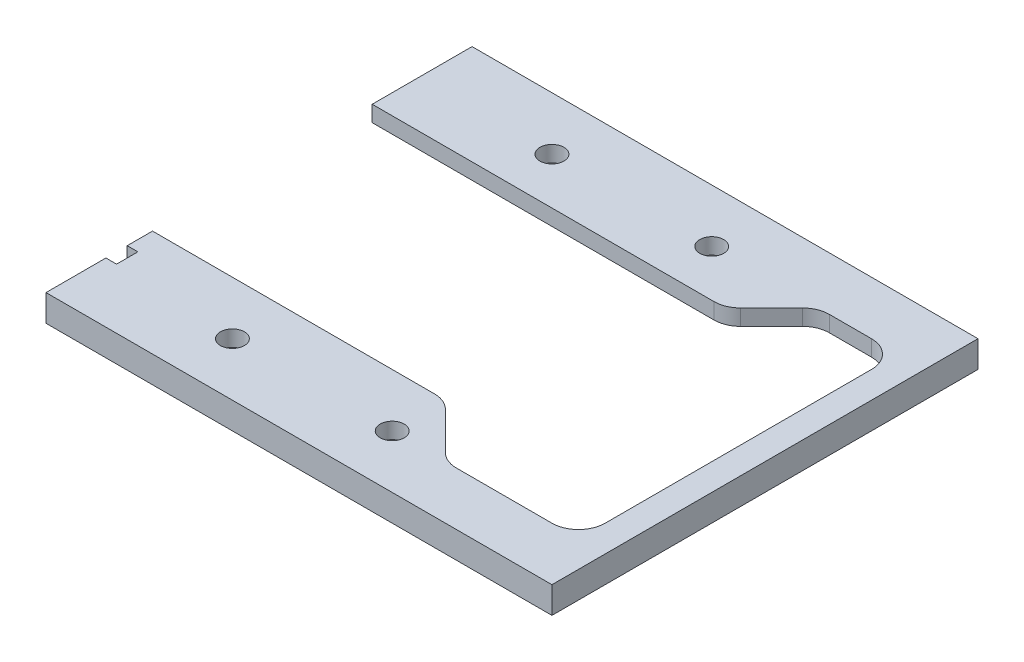
ISO-10303-21;
HEADER;
FILE_DESCRIPTION(('STEP AP214'),'2;1');
FILE_NAME('part.step','',(''),(''),'','','');
FILE_SCHEMA(('AUTOMOTIVE_DESIGN { 1 0 10303 214 1 1 1 1 }'));
ENDSEC;
DATA;
#1=APPLICATION_CONTEXT('core data for automotive mechanical design processes');
#2=APPLICATION_PROTOCOL_DEFINITION('international standard','automotive_design',2000,#1);
#3=PRODUCT_CONTEXT('',#1,'mechanical');
#4=PRODUCT('Part','Part','',(#3));
#5=PRODUCT_RELATED_PRODUCT_CATEGORY('part','',(#4));
#6=PRODUCT_DEFINITION_FORMATION('','',#4);
#7=PRODUCT_DEFINITION_CONTEXT('part definition',#1,'design');
#8=PRODUCT_DEFINITION('design','',#6,#7);
#9=PRODUCT_DEFINITION_SHAPE('','',#8);
#10=(LENGTH_UNIT() NAMED_UNIT(*) SI_UNIT(.MILLI.,.METRE.));
#11=(NAMED_UNIT(*) PLANE_ANGLE_UNIT() SI_UNIT($,.RADIAN.));
#12=(NAMED_UNIT(*) SI_UNIT($,.STERADIAN.) SOLID_ANGLE_UNIT());
#13=UNCERTAINTY_MEASURE_WITH_UNIT(LENGTH_MEASURE(1.E-05),#10,'distance_accuracy_value','');
#14=(GEOMETRIC_REPRESENTATION_CONTEXT(3) GLOBAL_UNCERTAINTY_ASSIGNED_CONTEXT((#13)) GLOBAL_UNIT_ASSIGNED_CONTEXT((#10,
#11,#12)) REPRESENTATION_CONTEXT('',''));
#15=CARTESIAN_POINT('',(0.,0.,0.));
#16=DIRECTION('',(0.,0.,1.));
#17=DIRECTION('',(1.,0.,0.));
#18=AXIS2_PLACEMENT_3D('',#15,#16,#17);
#19=CARTESIAN_POINT('',(9.99999999999797,-4.,9.99999999999848));
#20=DIRECTION('',(0.70710678118653,0.,0.707106781186566));
#21=DIRECTION('',(0.707106781186566,0.,-0.70710678118653));
#22=AXIS2_PLACEMENT_3D('',#19,#20,#21);
#23=PLANE('',#22);
#24=DIRECTION('',(0.707106781186566,0.,-0.70710678118653));
#25=VECTOR('',#24,1.);
#26=CARTESIAN_POINT('',(9.99999999999797,6.,9.99999999999848));
#27=LINE('',#26,#25);
#28=CARTESIAN_POINT('',(135.428932188137,6.,-115.428932188134));
#29=VERTEX_POINT('',#28);
#30=CARTESIAN_POINT('',(147.071067811869,6.,-127.071067811865));
#31=VERTEX_POINT('',#30);
#32=EDGE_CURVE('E223',#29,#31,#27,.T.);
#33=ORIENTED_EDGE('',*,*,#32,.F.);
#34=DIRECTION('',(0.,1.,0.));
#35=VECTOR('',#34,1.);
#36=CARTESIAN_POINT('',(135.428932188137,-4.,-115.428932188134));
#37=LINE('',#36,#35);
#38=CARTESIAN_POINT('',(135.428932188137,0.,-115.428932188134));
#39=VERTEX_POINT('',#38);
#40=EDGE_CURVE('E208',#39,#29,#37,.T.);
#41=ORIENTED_EDGE('',*,*,#40,.F.);
#42=DIRECTION('',(-0.707106781186566,0.,0.70710678118653));
#43=VECTOR('',#42,1.);
#44=CARTESIAN_POINT('',(9.99999999999797,0.,9.99999999999848));
#45=LINE('',#44,#43);
#46=CARTESIAN_POINT('',(147.071067811869,0.,-127.071067811865));
#47=VERTEX_POINT('',#46);
#48=EDGE_CURVE('E291',#47,#39,#45,.T.);
#49=ORIENTED_EDGE('',*,*,#48,.F.);
#50=DIRECTION('',(0.,1.,0.));
#51=VECTOR('',#50,1.);
#52=CARTESIAN_POINT('',(147.071067811869,-4.,-127.071067811865));
#53=LINE('',#52,#51);
#54=EDGE_CURVE('E229',#47,#31,#53,.T.);
#55=ORIENTED_EDGE('',*,*,#54,.T.);
#56=EDGE_LOOP('',(#33,#41,#49,#55));
#57=FACE_BOUND('',#56,.T.);
#58=ADVANCED_FACE('F38',(#57),#23,.T.);
#59=CARTESIAN_POINT('',(0.,-4.,-112.5));
#60=DIRECTION('',(0.,0.,-1.));
#61=DIRECTION('',(-1.,0.,0.));
#62=AXIS2_PLACEMENT_3D('',#59,#60,#61);
#63=PLANE('',#62);
#64=DIRECTION('',(0.,1.,0.));
#65=VECTOR('',#64,1.);
#66=CARTESIAN_POINT('',(128.357864376272,-4.,-112.5));
#67=LINE('',#66,#65);
#68=CARTESIAN_POINT('',(128.357864376272,6.,-112.5));
#69=VERTEX_POINT('',#68);
#70=CARTESIAN_POINT('',(128.357864376272,0.,-112.5));
#71=VERTEX_POINT('',#70);
#72=EDGE_CURVE('E46',#69,#71,#67,.F.);
#73=ORIENTED_EDGE('',*,*,#72,.F.);
#74=DIRECTION('',(-1.,0.,0.));
#75=VECTOR('',#74,1.);
#76=CARTESIAN_POINT('',(0.,6.,-112.5));
#77=LINE('',#76,#75);
#78=CARTESIAN_POINT('',(0.,6.,-112.5));
#79=VERTEX_POINT('',#78);
#80=EDGE_CURVE('E226',#69,#79,#77,.T.);
#81=ORIENTED_EDGE('',*,*,#80,.T.);
#82=DIRECTION('',(0.,1.,0.));
#83=VECTOR('',#82,1.);
#84=CARTESIAN_POINT('',(0.,-4.,-112.5));
#85=LINE('',#84,#83);
#86=CARTESIAN_POINT('',(0.,0.,-112.5));
#87=VERTEX_POINT('',#86);
#88=EDGE_CURVE('E302',#87,#79,#85,.T.);
#89=ORIENTED_EDGE('',*,*,#88,.F.);
#90=DIRECTION('',(1.,0.,0.));
#91=VECTOR('',#90,1.);
#92=CARTESIAN_POINT('',(0.,0.,-112.5));
#93=LINE('',#92,#91);
#94=EDGE_CURVE('E298',#87,#71,#93,.T.);
#95=ORIENTED_EDGE('',*,*,#94,.T.);
#96=EDGE_LOOP('',(#73,#81,#89,#95));
#97=FACE_BOUND('',#96,.T.);
#98=ADVANCED_FACE('F300',(#97),#63,.F.);
#99=CARTESIAN_POINT('',(0.,6.,0.));
#100=DIRECTION('',(1.,0.,0.));
#101=DIRECTION('',(0.,0.,-1.));
#102=AXIS2_PLACEMENT_3D('',#99,#100,#101);
#103=PLANE('',#102);
#104=DIRECTION('',(0.,0.,1.));
#105=VECTOR('',#104,1.);
#106=CARTESIAN_POINT('',(0.,6.,0.));
#107=LINE('',#106,#105);
#108=CARTESIAN_POINT('',(0.,6.,-12.5));
#109=VERTEX_POINT('',#108);
#110=CARTESIAN_POINT('',(0.,6.,10.));
#111=VERTEX_POINT('',#110);
#112=EDGE_CURVE('E257',#109,#111,#107,.T.);
#113=ORIENTED_EDGE('',*,*,#112,.F.);
#114=DIRECTION('',(0.,-1.,0.));
#115=VECTOR('',#114,1.);
#116=CARTESIAN_POINT('',(0.,10.,-12.5));
#117=LINE('',#116,#115);
#118=CARTESIAN_POINT('',(0.,0.,-12.5));
#119=VERTEX_POINT('',#118);
#120=EDGE_CURVE('E341',#109,#119,#117,.T.);
#121=ORIENTED_EDGE('',*,*,#120,.T.);
#122=DIRECTION('',(0.,0.,1.));
#123=VECTOR('',#122,1.);
#124=CARTESIAN_POINT('',(0.,0.,0.));
#125=LINE('',#124,#123);
#126=CARTESIAN_POINT('',(0.,0.,0.));
#127=VERTEX_POINT('',#126);
#128=EDGE_CURVE('E241',#119,#127,#125,.T.);
#129=ORIENTED_EDGE('',*,*,#128,.T.);
#130=DIRECTION('',(0.,-1.,0.));
#131=VECTOR('',#130,1.);
#132=CARTESIAN_POINT('',(0.,6.,0.));
#133=LINE('',#132,#131);
#134=CARTESIAN_POINT('',(0.,-4.,0.));
#135=VERTEX_POINT('',#134);
#136=EDGE_CURVE('E378',#127,#135,#133,.T.);
#137=ORIENTED_EDGE('',*,*,#136,.T.);
#138=DIRECTION('',(0.,0.,-1.));
#139=VECTOR('',#138,1.);
#140=CARTESIAN_POINT('',(0.,-4.,10.));
#141=LINE('',#140,#139);
#142=CARTESIAN_POINT('',(0.,-4.,10.));
#143=VERTEX_POINT('',#142);
#144=EDGE_CURVE('E392',#143,#135,#141,.T.);
#145=ORIENTED_EDGE('',*,*,#144,.F.);
#146=DIRECTION('',(0.,-1.,0.));
#147=VECTOR('',#146,1.);
#148=CARTESIAN_POINT('',(0.,6.,10.));
#149=LINE('',#148,#147);
#150=EDGE_CURVE('E379',#111,#143,#149,.T.);
#151=ORIENTED_EDGE('',*,*,#150,.F.);
#152=EDGE_LOOP('',(#113,#121,#129,#137,#145,#151));
#153=FACE_BOUND('',#152,.T.);
#154=ADVANCED_FACE('F488',(#153),#103,.F.);
#155=CARTESIAN_POINT('',(0.,6.,-30.));
#156=VERTEX_POINT('',#155);
#157=CARTESIAN_POINT('',(0.,6.,-20.5));
#158=VERTEX_POINT('',#157);
#159=EDGE_CURVE('E256',#156,#158,#107,.T.);
#160=ORIENTED_EDGE('',*,*,#159,.F.);
#161=DIRECTION('',(0.,1.,0.));
#162=VECTOR('',#161,1.);
#163=CARTESIAN_POINT('',(0.,-4.,-30.));
#164=LINE('',#163,#162);
#165=CARTESIAN_POINT('',(0.,0.,-30.));
#166=VERTEX_POINT('',#165);
#167=EDGE_CURVE('E469',#166,#156,#164,.T.);
#168=ORIENTED_EDGE('',*,*,#167,.F.);
#169=CARTESIAN_POINT('',(0.,0.,-20.5));
#170=VERTEX_POINT('',#169);
#171=EDGE_CURVE('E264',#166,#170,#125,.T.);
#172=ORIENTED_EDGE('',*,*,#171,.T.);
#173=DIRECTION('',(0.,-1.,0.));
#174=VECTOR('',#173,1.);
#175=CARTESIAN_POINT('',(0.,10.,-20.5));
#176=LINE('',#175,#174);
#177=EDGE_CURVE('E340',#158,#170,#176,.T.);
#178=ORIENTED_EDGE('',*,*,#177,.F.);
#179=EDGE_LOOP('',(#160,#168,#172,#178));
#180=FACE_BOUND('',#179,.T.);
#181=ADVANCED_FACE('F479',(#180),#103,.F.);
#182=CARTESIAN_POINT('',(2.4541772123293E-13,0.,-140.000000000001));
#183=VERTEX_POINT('',#182);
#184=EDGE_CURVE('E260',#183,#87,#125,.T.);
#185=ORIENTED_EDGE('',*,*,#184,.T.);
#186=ORIENTED_EDGE('',*,*,#88,.T.);
#187=CARTESIAN_POINT('',(0.,6.,-150.000000000001));
#188=VERTEX_POINT('',#187);
#189=EDGE_CURVE('E253',#188,#79,#107,.T.);
#190=ORIENTED_EDGE('',*,*,#189,.F.);
#191=DIRECTION('',(0.,1.,0.));
#192=VECTOR('',#191,1.);
#193=CARTESIAN_POINT('',(0.,6.,-150.000000000001));
#194=LINE('',#193,#192);
#195=CARTESIAN_POINT('',(4.09029535388217E-13,-4.,-150.000000000001));
#196=VERTEX_POINT('',#195);
#197=EDGE_CURVE('E360',#196,#188,#194,.T.);
#198=ORIENTED_EDGE('',*,*,#197,.F.);
#199=DIRECTION('',(0.,0.,1.));
#200=VECTOR('',#199,1.);
#201=CARTESIAN_POINT('',(4.09029535388217E-13,-4.,-150.000000000001));
#202=LINE('',#201,#200);
#203=CARTESIAN_POINT('',(4.09029535388217E-13,-4.,-140.000000000001));
#204=VERTEX_POINT('',#203);
#205=EDGE_CURVE('E372',#196,#204,#202,.T.);
#206=ORIENTED_EDGE('',*,*,#205,.T.);
#207=DIRECTION('',(0.,1.,0.));
#208=VECTOR('',#207,1.);
#209=CARTESIAN_POINT('',(0.,6.,-140.000000000001));
#210=LINE('',#209,#208);
#211=EDGE_CURVE('E359',#204,#183,#210,.T.);
#212=ORIENTED_EDGE('',*,*,#211,.T.);
#213=EDGE_LOOP('',(#185,#186,#190,#198,#206,#212));
#214=FACE_BOUND('',#213,.T.);
#215=ADVANCED_FACE('F40',(#214),#103,.F.);
#216=CARTESIAN_POINT('',(190.,6.,0.));
#217=DIRECTION('',(-1.,0.,0.));
#218=DIRECTION('',(0.,0.,1.));
#219=AXIS2_PLACEMENT_3D('',#216,#217,#218);
#220=PLANE('',#219);
#221=DIRECTION('',(0.,0.,-1.));
#222=VECTOR('',#221,1.);
#223=CARTESIAN_POINT('',(190.,6.,0.));
#224=LINE('',#223,#222);
#225=CARTESIAN_POINT('',(190.,6.,10.));
#226=VERTEX_POINT('',#225);
#227=CARTESIAN_POINT('',(190.,5.99999999999998,-150.000000000001));
#228=VERTEX_POINT('',#227);
#229=EDGE_CURVE('E255',#226,#228,#224,.T.);
#230=ORIENTED_EDGE('',*,*,#229,.F.);
#231=DIRECTION('',(0.,1.,0.));
#232=VECTOR('',#231,1.);
#233=CARTESIAN_POINT('',(190.,6.,10.));
#234=LINE('',#233,#232);
#235=CARTESIAN_POINT('',(190.,-4.,10.));
#236=VERTEX_POINT('',#235);
#237=EDGE_CURVE('E386',#236,#226,#234,.T.);
#238=ORIENTED_EDGE('',*,*,#237,.F.);
#239=DIRECTION('',(0.,0.,1.));
#240=VECTOR('',#239,1.);
#241=CARTESIAN_POINT('',(190.,-4.,0.));
#242=LINE('',#241,#240);
#243=CARTESIAN_POINT('',(190.,-4.,-150.000000000001));
#244=VERTEX_POINT('',#243);
#245=EDGE_CURVE('E401',#244,#236,#242,.T.);
#246=ORIENTED_EDGE('',*,*,#245,.F.);
#247=DIRECTION('',(0.,-1.,0.));
#248=VECTOR('',#247,1.);
#249=CARTESIAN_POINT('',(190.,5.99999999999998,-150.000000000001));
#250=LINE('',#249,#248);
#251=EDGE_CURVE('E367',#228,#244,#250,.T.);
#252=ORIENTED_EDGE('',*,*,#251,.F.);
#253=EDGE_LOOP('',(#230,#238,#246,#252));
#254=FACE_BOUND('',#253,.T.);
#255=ADVANCED_FACE('F496',(#254),#220,.F.);
#256=CARTESIAN_POINT('',(0.,6.,0.));
#257=DIRECTION('',(0.,-1.,0.));
#258=DIRECTION('',(0.,0.,-1.));
#259=AXIS2_PLACEMENT_3D('',#256,#257,#258);
#260=PLANE('',#259);
#261=CARTESIAN_POINT('',(50.,6.,-130.000000000001));
#262=DIRECTION('',(0.,1.,0.));
#263=DIRECTION('',(0.,0.,-1.));
#264=AXIS2_PLACEMENT_3D('',#261,#262,#263);
#265=CIRCLE('',#264,4.50000000000001);
#266=CARTESIAN_POINT('',(50.,6.,-134.500000000001));
#267=VERTEX_POINT('',#266);
#268=EDGE_CURVE('E307',#267,#267,#265,.T.);
#269=ORIENTED_EDGE('',*,*,#268,.F.);
#270=EDGE_LOOP('',(#269));
#271=FACE_BOUND('',#270,.T.);
#272=CARTESIAN_POINT('',(110.,6.,-130.000000000001));
#273=DIRECTION('',(0.,1.,0.));
#274=DIRECTION('',(0.,0.,-1.));
#275=AXIS2_PLACEMENT_3D('',#272,#273,#274);
#276=CIRCLE('',#275,4.50000000000001);
#277=CARTESIAN_POINT('',(110.,6.,-134.500000000001));
#278=VERTEX_POINT('',#277);
#279=EDGE_CURVE('E319',#278,#278,#276,.T.);
#280=ORIENTED_EDGE('',*,*,#279,.F.);
#281=EDGE_LOOP('',(#280));
#282=FACE_BOUND('',#281,.T.);
#283=CARTESIAN_POINT('',(110.,6.,-10.));
#284=DIRECTION('',(0.,1.,0.));
#285=DIRECTION('',(0.,0.,1.));
#286=AXIS2_PLACEMENT_3D('',#283,#284,#285);
#287=CIRCLE('',#286,4.5);
#288=CARTESIAN_POINT('',(110.,6.,-5.5));
#289=VERTEX_POINT('',#288);
#290=EDGE_CURVE('E312',#289,#289,#287,.T.);
#291=ORIENTED_EDGE('',*,*,#290,.F.);
#292=EDGE_LOOP('',(#291));
#293=FACE_BOUND('',#292,.T.);
#294=CARTESIAN_POINT('',(50.,6.,-10.));
#295=DIRECTION('',(0.,1.,0.));
#296=DIRECTION('',(0.,0.,1.));
#297=AXIS2_PLACEMENT_3D('',#294,#295,#296);
#298=CIRCLE('',#297,4.5);
#299=CARTESIAN_POINT('',(50.,6.,-5.5));
#300=VERTEX_POINT('',#299);
#301=EDGE_CURVE('E327',#300,#300,#298,.T.);
#302=ORIENTED_EDGE('',*,*,#301,.F.);
#303=EDGE_LOOP('',(#302));
#304=FACE_BOUND('',#303,.T.);
#305=DIRECTION('',(-0.707106781186548,0.,-0.707106781186547));
#306=VECTOR('',#305,1.);
#307=CARTESIAN_POINT('',(70.0000000000013,6.,-70.0000000000014));
#308=LINE('',#307,#306);
#309=CARTESIAN_POINT('',(127.071067811868,6.,-12.9289321881345));
#310=VERTEX_POINT('',#309);
#311=CARTESIAN_POINT('',(112.928932188137,6.,-27.0710678118655));
#312=VERTEX_POINT('',#311);
#313=EDGE_CURVE('E411',#310,#312,#308,.T.);
#314=ORIENTED_EDGE('',*,*,#313,.T.);
#315=CARTESIAN_POINT('',(105.857864376272,6.,-20.));
#316=DIRECTION('',(0.,-1.,0.));
#317=DIRECTION('',(0.,0.,-1.));
#318=AXIS2_PLACEMENT_3D('',#315,#316,#317);
#319=CIRCLE('',#318,10.);
#320=CARTESIAN_POINT('',(105.857864376272,6.,-30.));
#321=VERTEX_POINT('',#320);
#322=EDGE_CURVE('E216',#321,#312,#319,.T.);
#323=ORIENTED_EDGE('',*,*,#322,.F.);
#324=DIRECTION('',(1.,0.,0.));
#325=VECTOR('',#324,1.);
#326=CARTESIAN_POINT('',(0.,6.,-30.));
#327=LINE('',#326,#325);
#328=EDGE_CURVE('E466',#156,#321,#327,.T.);
#329=ORIENTED_EDGE('',*,*,#328,.F.);
#330=ORIENTED_EDGE('',*,*,#159,.T.);
#331=DIRECTION('',(1.,0.,0.));
#332=VECTOR('',#331,1.);
#333=CARTESIAN_POINT('',(0.,6.,-20.5));
#334=LINE('',#333,#332);
#335=CARTESIAN_POINT('',(4.,6.,-20.5));
#336=VERTEX_POINT('',#335);
#337=EDGE_CURVE('E344',#158,#336,#334,.T.);
#338=ORIENTED_EDGE('',*,*,#337,.T.);
#339=DIRECTION('',(0.,0.,1.));
#340=VECTOR('',#339,1.);
#341=CARTESIAN_POINT('',(4.,6.,0.));
#342=LINE('',#341,#340);
#343=CARTESIAN_POINT('',(4.,6.,-12.5));
#344=VERTEX_POINT('',#343);
#345=EDGE_CURVE('E353',#336,#344,#342,.T.);
#346=ORIENTED_EDGE('',*,*,#345,.T.);
#347=DIRECTION('',(-1.,0.,0.));
#348=VECTOR('',#347,1.);
#349=CARTESIAN_POINT('',(0.,6.,-12.5));
#350=LINE('',#349,#348);
#351=EDGE_CURVE('E356',#344,#109,#350,.T.);
#352=ORIENTED_EDGE('',*,*,#351,.T.);
#353=ORIENTED_EDGE('',*,*,#112,.T.);
#354=DIRECTION('',(-1.,0.,0.));
#355=VECTOR('',#354,1.);
#356=CARTESIAN_POINT('',(0.,6.,10.));
#357=LINE('',#356,#355);
#358=EDGE_CURVE('E389',#226,#111,#357,.T.);
#359=ORIENTED_EDGE('',*,*,#358,.F.);
#360=ORIENTED_EDGE('',*,*,#229,.T.);
#361=DIRECTION('',(1.,0.,0.));
#362=VECTOR('',#361,1.);
#363=CARTESIAN_POINT('',(0.,6.,-150.000000000001));
#364=LINE('',#363,#362);
#365=EDGE_CURVE('E363',#188,#228,#364,.T.);
#366=ORIENTED_EDGE('',*,*,#365,.F.);
#367=ORIENTED_EDGE('',*,*,#189,.T.);
#368=ORIENTED_EDGE('',*,*,#80,.F.);
#369=CARTESIAN_POINT('',(128.357864376272,6.,-122.5));
#370=DIRECTION('',(0.,-1.,0.));
#371=DIRECTION('',(0.,0.,1.));
#372=AXIS2_PLACEMENT_3D('',#369,#370,#371);
#373=CIRCLE('',#372,10.);
#374=EDGE_CURVE('E60',#29,#69,#373,.T.);
#375=ORIENTED_EDGE('',*,*,#374,.F.);
#376=ORIENTED_EDGE('',*,*,#32,.T.);
#377=CARTESIAN_POINT('',(154.142135623732,6.,-120.));
#378=DIRECTION('',(0.,1.,0.));
#379=DIRECTION('',(0.,0.,1.));
#380=AXIS2_PLACEMENT_3D('',#377,#378,#379);
#381=CIRCLE('',#380,9.9999999999992);
#382=CARTESIAN_POINT('',(154.142135623734,6.,-130.));
#383=VERTEX_POINT('',#382);
#384=EDGE_CURVE('E232',#31,#383,#381,.F.);
#385=ORIENTED_EDGE('',*,*,#384,.T.);
#386=DIRECTION('',(1.,0.,0.));
#387=VECTOR('',#386,1.);
#388=CARTESIAN_POINT('',(-3.18549499616373E-12,6.,-129.999999999996));
#389=LINE('',#388,#387);
#390=CARTESIAN_POINT('',(170.000000000001,6.,-130.));
#391=VERTEX_POINT('',#390);
#392=EDGE_CURVE('E236',#383,#391,#389,.T.);
#393=ORIENTED_EDGE('',*,*,#392,.T.);
#394=CARTESIAN_POINT('',(170.000000000001,6.,-120.));
#395=DIRECTION('',(0.,1.,0.));
#396=DIRECTION('',(0.,0.,1.));
#397=AXIS2_PLACEMENT_3D('',#394,#395,#396);
#398=CIRCLE('',#397,10.);
#399=CARTESIAN_POINT('',(180.000000000001,6.,-120.));
#400=VERTEX_POINT('',#399);
#401=EDGE_CURVE('E425',#391,#400,#398,.F.);
#402=ORIENTED_EDGE('',*,*,#401,.T.);
#403=DIRECTION('',(0.,0.,1.));
#404=VECTOR('',#403,1.);
#405=CARTESIAN_POINT('',(180.000000000001,6.,0.));
#406=LINE('',#405,#404);
#407=CARTESIAN_POINT('',(180.000000000001,6.,-20.));
#408=VERTEX_POINT('',#407);
#409=EDGE_CURVE('E422',#400,#408,#406,.T.);
#410=ORIENTED_EDGE('',*,*,#409,.T.);
#411=CARTESIAN_POINT('',(170.000000000001,6.,-20.));
#412=DIRECTION('',(0.,1.,0.));
#413=DIRECTION('',(0.,0.,1.));
#414=AXIS2_PLACEMENT_3D('',#411,#412,#413);
#415=CIRCLE('',#414,10.);
#416=CARTESIAN_POINT('',(170.000000000001,6.,-10.));
#417=VERTEX_POINT('',#416);
#418=EDGE_CURVE('E419',#408,#417,#415,.F.);
#419=ORIENTED_EDGE('',*,*,#418,.T.);
#420=DIRECTION('',(-1.,0.,0.));
#421=VECTOR('',#420,1.);
#422=CARTESIAN_POINT('',(0.,6.,-9.99999999999999));
#423=LINE('',#422,#421);
#424=CARTESIAN_POINT('',(134.142135623734,6.,-10.));
#425=VERTEX_POINT('',#424);
#426=EDGE_CURVE('E416',#417,#425,#423,.T.);
#427=ORIENTED_EDGE('',*,*,#426,.T.);
#428=CARTESIAN_POINT('',(134.142135623734,6.,-20.));
#429=DIRECTION('',(0.,1.,0.));
#430=DIRECTION('',(0.,0.,1.));
#431=AXIS2_PLACEMENT_3D('',#428,#429,#430);
#432=CIRCLE('',#431,10.);
#433=EDGE_CURVE('E413',#310,#425,#432,.T.);
#434=ORIENTED_EDGE('',*,*,#433,.F.);
#435=EDGE_LOOP('',(#314,#323,#329,#330,#338,#346,#352,#353,#359,#360,#366,#367,#368,#375,#376,
#385,#393,#402,#410,#419,#427,#434));
#436=FACE_BOUND('',#435,.T.);
#437=ADVANCED_FACE('F221',(#271,#282,#293,#304,#436),#260,.F.);
#438=CARTESIAN_POINT('',(0.,0.,0.));
#439=DIRECTION('',(0.,-1.,0.));
#440=DIRECTION('',(0.,0.,-1.));
#441=AXIS2_PLACEMENT_3D('',#438,#439,#440);
#442=PLANE('',#441);
#443=CARTESIAN_POINT('',(105.857864376272,0.,-20.));
#444=DIRECTION('',(0.,-1.,0.));
#445=DIRECTION('',(0.,0.,-1.));
#446=AXIS2_PLACEMENT_3D('',#443,#444,#445);
#447=CIRCLE('',#446,10.);
#448=CARTESIAN_POINT('',(112.928932188137,0.,-27.0710678118655));
#449=VERTEX_POINT('',#448);
#450=CARTESIAN_POINT('',(105.857864376272,0.,-30.));
#451=VERTEX_POINT('',#450);
#452=EDGE_CURVE('E53',#449,#451,#447,.F.);
#453=ORIENTED_EDGE('',*,*,#452,.F.);
#454=DIRECTION('',(0.707106781186548,0.,0.707106781186547));
#455=VECTOR('',#454,1.);
#456=CARTESIAN_POINT('',(70.0000000000013,0.,-70.0000000000014));
#457=LINE('',#456,#455);
#458=CARTESIAN_POINT('',(127.071067811868,0.,-12.9289321881345));
#459=VERTEX_POINT('',#458);
#460=EDGE_CURVE('E259',#449,#459,#457,.T.);
#461=ORIENTED_EDGE('',*,*,#460,.T.);
#462=CARTESIAN_POINT('',(134.142135623734,0.,-20.));
#463=DIRECTION('',(0.,-1.,0.));
#464=DIRECTION('',(0.,0.,-1.));
#465=AXIS2_PLACEMENT_3D('',#462,#463,#464);
#466=CIRCLE('',#465,10.);
#467=CARTESIAN_POINT('',(134.142135623734,0.,-10.));
#468=VERTEX_POINT('',#467);
#469=EDGE_CURVE('E270',#468,#459,#466,.T.);
#470=ORIENTED_EDGE('',*,*,#469,.F.);
#471=DIRECTION('',(1.,0.,0.));
#472=VECTOR('',#471,1.);
#473=CARTESIAN_POINT('',(0.,0.,-9.99999999999999));
#474=LINE('',#473,#472);
#475=CARTESIAN_POINT('',(170.000000000001,0.,-10.));
#476=VERTEX_POINT('',#475);
#477=EDGE_CURVE('E273',#468,#476,#474,.T.);
#478=ORIENTED_EDGE('',*,*,#477,.T.);
#479=CARTESIAN_POINT('',(170.000000000001,0.,-20.));
#480=DIRECTION('',(0.,-1.,0.));
#481=DIRECTION('',(0.,0.,-1.));
#482=AXIS2_PLACEMENT_3D('',#479,#480,#481);
#483=CIRCLE('',#482,10.);
#484=CARTESIAN_POINT('',(180.000000000001,0.,-20.));
#485=VERTEX_POINT('',#484);
#486=EDGE_CURVE('E276',#476,#485,#483,.F.);
#487=ORIENTED_EDGE('',*,*,#486,.T.);
#488=DIRECTION('',(0.,0.,-1.));
#489=VECTOR('',#488,1.);
#490=CARTESIAN_POINT('',(180.000000000001,0.,0.));
#491=LINE('',#490,#489);
#492=CARTESIAN_POINT('',(180.000000000001,0.,-120.));
#493=VERTEX_POINT('',#492);
#494=EDGE_CURVE('E279',#485,#493,#491,.T.);
#495=ORIENTED_EDGE('',*,*,#494,.T.);
#496=CARTESIAN_POINT('',(170.000000000001,0.,-120.));
#497=DIRECTION('',(0.,-1.,0.));
#498=DIRECTION('',(0.,0.,-1.));
#499=AXIS2_PLACEMENT_3D('',#496,#497,#498);
#500=CIRCLE('',#499,10.);
#501=CARTESIAN_POINT('',(170.000000000001,0.,-130.));
#502=VERTEX_POINT('',#501);
#503=EDGE_CURVE('E282',#493,#502,#500,.F.);
#504=ORIENTED_EDGE('',*,*,#503,.T.);
#505=DIRECTION('',(-1.,0.,0.));
#506=VECTOR('',#505,1.);
#507=CARTESIAN_POINT('',(-3.18549499616373E-12,0.,-129.999999999996));
#508=LINE('',#507,#506);
#509=CARTESIAN_POINT('',(154.142135623734,0.,-130.));
#510=VERTEX_POINT('',#509);
#511=EDGE_CURVE('E285',#502,#510,#508,.T.);
#512=ORIENTED_EDGE('',*,*,#511,.T.);
#513=CARTESIAN_POINT('',(154.142135623732,0.,-120.));
#514=DIRECTION('',(0.,-1.,0.));
#515=DIRECTION('',(0.,0.,-1.));
#516=AXIS2_PLACEMENT_3D('',#513,#514,#515);
#517=CIRCLE('',#516,9.9999999999992);
#518=EDGE_CURVE('E288',#510,#47,#517,.F.);
#519=ORIENTED_EDGE('',*,*,#518,.T.);
#520=ORIENTED_EDGE('',*,*,#48,.T.);
#521=CARTESIAN_POINT('',(128.357864376272,0.,-122.5));
#522=DIRECTION('',(0.,-1.,0.));
#523=DIRECTION('',(0.,0.,-1.));
#524=AXIS2_PLACEMENT_3D('',#521,#522,#523);
#525=CIRCLE('',#524,10.);
#526=EDGE_CURVE('E211',#71,#39,#525,.F.);
#527=ORIENTED_EDGE('',*,*,#526,.F.);
#528=ORIENTED_EDGE('',*,*,#94,.F.);
#529=ORIENTED_EDGE('',*,*,#184,.F.);
#530=DIRECTION('',(-1.,0.,0.));
#531=VECTOR('',#530,1.);
#532=CARTESIAN_POINT('',(0.,0.,-140.000000000001));
#533=LINE('',#532,#531);
#534=CARTESIAN_POINT('',(185.,0.,-140.));
#535=VERTEX_POINT('',#534);
#536=EDGE_CURVE('E266',#535,#183,#533,.T.);
#537=ORIENTED_EDGE('',*,*,#536,.F.);
#538=DIRECTION('',(0.,0.,-1.));
#539=VECTOR('',#538,1.);
#540=CARTESIAN_POINT('',(185.,0.,0.));
#541=LINE('',#540,#539);
#542=CARTESIAN_POINT('',(185.,0.,0.));
#543=VERTEX_POINT('',#542);
#544=EDGE_CURVE('E398',#543,#535,#541,.T.);
#545=ORIENTED_EDGE('',*,*,#544,.F.);
#546=DIRECTION('',(1.,0.,0.));
#547=VECTOR('',#546,1.);
#548=CARTESIAN_POINT('',(0.,0.,0.));
#549=LINE('',#548,#547);
#550=EDGE_CURVE('E263',#127,#543,#549,.T.);
#551=ORIENTED_EDGE('',*,*,#550,.F.);
#552=ORIENTED_EDGE('',*,*,#128,.F.);
#553=DIRECTION('',(-1.,0.,0.));
#554=VECTOR('',#553,1.);
#555=CARTESIAN_POINT('',(0.,0.,-12.5));
#556=LINE('',#555,#554);
#557=CARTESIAN_POINT('',(4.,0.,-12.5));
#558=VERTEX_POINT('',#557);
#559=EDGE_CURVE('E338',#558,#119,#556,.T.);
#560=ORIENTED_EDGE('',*,*,#559,.F.);
#561=DIRECTION('',(0.,0.,1.));
#562=VECTOR('',#561,1.);
#563=CARTESIAN_POINT('',(4.,0.,-20.5));
#564=LINE('',#563,#562);
#565=CARTESIAN_POINT('',(4.,0.,-20.5));
#566=VERTEX_POINT('',#565);
#567=EDGE_CURVE('E335',#566,#558,#564,.T.);
#568=ORIENTED_EDGE('',*,*,#567,.F.);
#569=DIRECTION('',(1.,0.,0.));
#570=VECTOR('',#569,1.);
#571=CARTESIAN_POINT('',(0.,0.,-20.5));
#572=LINE('',#571,#570);
#573=EDGE_CURVE('E330',#170,#566,#572,.T.);
#574=ORIENTED_EDGE('',*,*,#573,.F.);
#575=ORIENTED_EDGE('',*,*,#171,.F.);
#576=DIRECTION('',(-1.,0.,0.));
#577=VECTOR('',#576,1.);
#578=CARTESIAN_POINT('',(0.,0.,-30.));
#579=LINE('',#578,#577);
#580=EDGE_CURVE('E304',#451,#166,#579,.T.);
#581=ORIENTED_EDGE('',*,*,#580,.F.);
#582=EDGE_LOOP('',(#453,#461,#470,#478,#487,#495,#504,#512,#519,#520,#527,#528,#529,#537,#545,
#551,#552,#560,#568,#574,#575,#581));
#583=FACE_BOUND('',#582,.T.);
#584=CARTESIAN_POINT('',(50.,0.,-130.000000000001));
#585=DIRECTION('',(0.,1.,0.));
#586=DIRECTION('',(0.,0.,-1.));
#587=AXIS2_PLACEMENT_3D('',#584,#585,#586);
#588=CIRCLE('',#587,4.50000000000001);
#589=CARTESIAN_POINT('',(50.,0.,-134.500000000001));
#590=VERTEX_POINT('',#589);
#591=EDGE_CURVE('E303',#590,#590,#588,.T.);
#592=ORIENTED_EDGE('',*,*,#591,.T.);
#593=EDGE_LOOP('',(#592));
#594=FACE_BOUND('',#593,.T.);
#595=CARTESIAN_POINT('',(110.,0.,-130.000000000001));
#596=DIRECTION('',(0.,1.,0.));
#597=DIRECTION('',(0.,0.,-1.));
#598=AXIS2_PLACEMENT_3D('',#595,#596,#597);
#599=CIRCLE('',#598,4.50000000000001);
#600=CARTESIAN_POINT('',(110.,0.,-134.500000000001));
#601=VERTEX_POINT('',#600);
#602=EDGE_CURVE('E322',#601,#601,#599,.T.);
#603=ORIENTED_EDGE('',*,*,#602,.T.);
#604=EDGE_LOOP('',(#603));
#605=FACE_BOUND('',#604,.T.);
#606=CARTESIAN_POINT('',(110.,0.,-10.));
#607=DIRECTION('',(0.,1.,0.));
#608=DIRECTION('',(0.,0.,1.));
#609=AXIS2_PLACEMENT_3D('',#606,#607,#608);
#610=CIRCLE('',#609,4.5);
#611=CARTESIAN_POINT('',(110.,0.,-5.5));
#612=VERTEX_POINT('',#611);
#613=EDGE_CURVE('E316',#612,#612,#610,.T.);
#614=ORIENTED_EDGE('',*,*,#613,.T.);
#615=EDGE_LOOP('',(#614));
#616=FACE_BOUND('',#615,.T.);
#617=CARTESIAN_POINT('',(50.,0.,-10.));
#618=DIRECTION('',(0.,1.,0.));
#619=DIRECTION('',(0.,0.,1.));
#620=AXIS2_PLACEMENT_3D('',#617,#618,#619);
#621=CIRCLE('',#620,4.5);
#622=CARTESIAN_POINT('',(50.,0.,-5.5));
#623=VERTEX_POINT('',#622);
#624=EDGE_CURVE('E315',#623,#623,#621,.T.);
#625=ORIENTED_EDGE('',*,*,#624,.T.);
#626=EDGE_LOOP('',(#625));
#627=FACE_BOUND('',#626,.T.);
#628=ADVANCED_FACE('F296',(#583,#594,#605,#616,#627),#442,.T.);
#629=CARTESIAN_POINT('',(154.142135623732,-4.,-120.));
#630=DIRECTION('',(0.,1.,0.));
#631=DIRECTION('',(0.,0.,1.));
#632=AXIS2_PLACEMENT_3D('',#629,#630,#631);
#633=CYLINDRICAL_SURFACE('',#632,9.9999999999992);
#634=DIRECTION('',(0.,1.,0.));
#635=VECTOR('',#634,1.);
#636=CARTESIAN_POINT('',(154.142135623734,-4.,-130.));
#637=LINE('',#636,#635);
#638=EDGE_CURVE('E242',#510,#383,#637,.T.);
#639=ORIENTED_EDGE('',*,*,#638,.T.);
#640=ORIENTED_EDGE('',*,*,#384,.F.);
#641=ORIENTED_EDGE('',*,*,#54,.F.);
#642=ORIENTED_EDGE('',*,*,#518,.F.);
#643=EDGE_LOOP('',(#639,#640,#641,#642));
#644=FACE_BOUND('',#643,.T.);
#645=ADVANCED_FACE('F533',(#644),#633,.F.);
#646=CARTESIAN_POINT('',(-3.18549499616373E-12,-4.,-129.999999999996));
#647=DIRECTION('',(0.,0.,1.));
#648=DIRECTION('',(1.,0.,0.));
#649=AXIS2_PLACEMENT_3D('',#646,#647,#648);
#650=PLANE('',#649);
#651=DIRECTION('',(0.,1.,0.));
#652=VECTOR('',#651,1.);
#653=CARTESIAN_POINT('',(170.000000000001,-4.,-130.));
#654=LINE('',#653,#652);
#655=EDGE_CURVE('E244',#502,#391,#654,.T.);
#656=ORIENTED_EDGE('',*,*,#655,.T.);
#657=ORIENTED_EDGE('',*,*,#392,.F.);
#658=ORIENTED_EDGE('',*,*,#638,.F.);
#659=ORIENTED_EDGE('',*,*,#511,.F.);
#660=EDGE_LOOP('',(#656,#657,#658,#659));
#661=FACE_BOUND('',#660,.T.);
#662=ADVANCED_FACE('F432',(#661),#650,.T.);
#663=CARTESIAN_POINT('',(170.000000000001,-4.,-120.));
#664=DIRECTION('',(0.,1.,0.));
#665=DIRECTION('',(0.,0.,1.));
#666=AXIS2_PLACEMENT_3D('',#663,#664,#665);
#667=CYLINDRICAL_SURFACE('',#666,10.);
#668=DIRECTION('',(0.,1.,0.));
#669=VECTOR('',#668,1.);
#670=CARTESIAN_POINT('',(180.000000000001,-4.,-120.));
#671=LINE('',#670,#669);
#672=EDGE_CURVE('E246',#493,#400,#671,.T.);
#673=ORIENTED_EDGE('',*,*,#672,.T.);
#674=ORIENTED_EDGE('',*,*,#401,.F.);
#675=ORIENTED_EDGE('',*,*,#655,.F.);
#676=ORIENTED_EDGE('',*,*,#503,.F.);
#677=EDGE_LOOP('',(#673,#674,#675,#676));
#678=FACE_BOUND('',#677,.T.);
#679=ADVANCED_FACE('F435',(#678),#667,.F.);
#680=CARTESIAN_POINT('',(180.000000000001,-4.,0.));
#681=DIRECTION('',(-1.,0.,0.));
#682=DIRECTION('',(0.,0.,1.));
#683=AXIS2_PLACEMENT_3D('',#680,#681,#682);
#684=PLANE('',#683);
#685=DIRECTION('',(0.,1.,0.));
#686=VECTOR('',#685,1.);
#687=CARTESIAN_POINT('',(180.000000000001,-4.,-20.));
#688=LINE('',#687,#686);
#689=EDGE_CURVE('E248',#485,#408,#688,.T.);
#690=ORIENTED_EDGE('',*,*,#689,.T.);
#691=ORIENTED_EDGE('',*,*,#409,.F.);
#692=ORIENTED_EDGE('',*,*,#672,.F.);
#693=ORIENTED_EDGE('',*,*,#494,.F.);
#694=EDGE_LOOP('',(#690,#691,#692,#693));
#695=FACE_BOUND('',#694,.T.);
#696=ADVANCED_FACE('F439',(#695),#684,.T.);
#697=CARTESIAN_POINT('',(170.000000000001,-4.,-20.));
#698=DIRECTION('',(0.,1.,0.));
#699=DIRECTION('',(0.,0.,1.));
#700=AXIS2_PLACEMENT_3D('',#697,#698,#699);
#701=CYLINDRICAL_SURFACE('',#700,10.);
#702=DIRECTION('',(0.,1.,0.));
#703=VECTOR('',#702,1.);
#704=CARTESIAN_POINT('',(170.000000000001,-4.,-10.));
#705=LINE('',#704,#703);
#706=EDGE_CURVE('E250',#476,#417,#705,.T.);
#707=ORIENTED_EDGE('',*,*,#706,.T.);
#708=ORIENTED_EDGE('',*,*,#418,.F.);
#709=ORIENTED_EDGE('',*,*,#689,.F.);
#710=ORIENTED_EDGE('',*,*,#486,.F.);
#711=EDGE_LOOP('',(#707,#708,#709,#710));
#712=FACE_BOUND('',#711,.T.);
#713=ADVANCED_FACE('F445',(#712),#701,.F.);
#714=CARTESIAN_POINT('',(0.,-4.,-9.99999999999999));
#715=DIRECTION('',(0.,0.,-1.));
#716=DIRECTION('',(-1.,0.,0.));
#717=AXIS2_PLACEMENT_3D('',#714,#715,#716);
#718=PLANE('',#717);
#719=DIRECTION('',(0.,1.,0.));
#720=VECTOR('',#719,1.);
#721=CARTESIAN_POINT('',(134.142135623734,-4.,-10.));
#722=LINE('',#721,#720);
#723=EDGE_CURVE('E234',#468,#425,#722,.T.);
#724=ORIENTED_EDGE('',*,*,#723,.T.);
#725=ORIENTED_EDGE('',*,*,#426,.F.);
#726=ORIENTED_EDGE('',*,*,#706,.F.);
#727=ORIENTED_EDGE('',*,*,#477,.F.);
#728=EDGE_LOOP('',(#724,#725,#726,#727));
#729=FACE_BOUND('',#728,.T.);
#730=ADVANCED_FACE('F448',(#729),#718,.T.);
#731=CARTESIAN_POINT('',(134.142135623734,-4.,-20.));
#732=DIRECTION('',(0.,1.,0.));
#733=DIRECTION('',(0.,0.,1.));
#734=AXIS2_PLACEMENT_3D('',#731,#732,#733);
#735=CYLINDRICAL_SURFACE('',#734,10.);
#736=ORIENTED_EDGE('',*,*,#469,.T.);
#737=DIRECTION('',(0.,1.,0.));
#738=VECTOR('',#737,1.);
#739=CARTESIAN_POINT('',(127.071067811868,-4.,-12.9289321881345));
#740=LINE('',#739,#738);
#741=EDGE_CURVE('E231',#459,#310,#740,.T.);
#742=ORIENTED_EDGE('',*,*,#741,.T.);
#743=ORIENTED_EDGE('',*,*,#433,.T.);
#744=ORIENTED_EDGE('',*,*,#723,.F.);
#745=EDGE_LOOP('',(#736,#742,#743,#744));
#746=FACE_BOUND('',#745,.T.);
#747=ADVANCED_FACE('F452',(#746),#735,.F.);
#748=CARTESIAN_POINT('',(70.0000000000013,-4.,-70.0000000000014));
#749=DIRECTION('',(0.707106781186547,0.,-0.707106781186548));
#750=DIRECTION('',(-0.707106781186548,0.,-0.707106781186547));
#751=AXIS2_PLACEMENT_3D('',#748,#749,#750);
#752=PLANE('',#751);
#753=DIRECTION('',(0.,1.,0.));
#754=VECTOR('',#753,1.);
#755=CARTESIAN_POINT('',(112.928932188137,-4.,-27.0710678118655));
#756=LINE('',#755,#754);
#757=EDGE_CURVE('E215',#449,#312,#756,.T.);
#758=ORIENTED_EDGE('',*,*,#757,.T.);
#759=ORIENTED_EDGE('',*,*,#313,.F.);
#760=ORIENTED_EDGE('',*,*,#741,.F.);
#761=ORIENTED_EDGE('',*,*,#460,.F.);
#762=EDGE_LOOP('',(#758,#759,#760,#761));
#763=FACE_BOUND('',#762,.T.);
#764=ADVANCED_FACE('F460',(#763),#752,.T.);
#765=CARTESIAN_POINT('',(185.,-4.,0.));
#766=DIRECTION('',(1.,0.,0.));
#767=DIRECTION('',(0.,0.,-1.));
#768=AXIS2_PLACEMENT_3D('',#765,#766,#767);
#769=PLANE('',#768);
#770=ORIENTED_EDGE('',*,*,#544,.T.);
#771=DIRECTION('',(0.,1.,0.));
#772=VECTOR('',#771,1.);
#773=CARTESIAN_POINT('',(185.,-4.,-140.));
#774=LINE('',#773,#772);
#775=CARTESIAN_POINT('',(185.,-4.,-140.));
#776=VERTEX_POINT('',#775);
#777=EDGE_CURVE('E403',#776,#535,#774,.T.);
#778=ORIENTED_EDGE('',*,*,#777,.F.);
#779=DIRECTION('',(0.,0.,-1.));
#780=VECTOR('',#779,1.);
#781=CARTESIAN_POINT('',(185.,-4.,0.));
#782=LINE('',#781,#780);
#783=CARTESIAN_POINT('',(185.,-4.,0.));
#784=VERTEX_POINT('',#783);
#785=EDGE_CURVE('E399',#784,#776,#782,.T.);
#786=ORIENTED_EDGE('',*,*,#785,.F.);
#787=DIRECTION('',(0.,1.,0.));
#788=VECTOR('',#787,1.);
#789=CARTESIAN_POINT('',(185.,-4.,0.));
#790=LINE('',#789,#788);
#791=EDGE_CURVE('E408',#784,#543,#790,.T.);
#792=ORIENTED_EDGE('',*,*,#791,.T.);
#793=EDGE_LOOP('',(#770,#778,#786,#792));
#794=FACE_BOUND('',#793,.T.);
#795=ADVANCED_FACE('F511',(#794),#769,.F.);
#796=CARTESIAN_POINT('',(0.,-4.,0.));
#797=DIRECTION('',(0.,-1.,0.));
#798=DIRECTION('',(0.,0.,-1.));
#799=AXIS2_PLACEMENT_3D('',#796,#797,#798);
#800=PLANE('',#799);
#801=ORIENTED_EDGE('',*,*,#245,.T.);
#802=DIRECTION('',(1.,0.,0.));
#803=VECTOR('',#802,1.);
#804=CARTESIAN_POINT('',(0.,-4.,10.));
#805=LINE('',#804,#803);
#806=EDGE_CURVE('E382',#143,#236,#805,.T.);
#807=ORIENTED_EDGE('',*,*,#806,.F.);
#808=ORIENTED_EDGE('',*,*,#144,.T.);
#809=DIRECTION('',(1.,0.,0.));
#810=VECTOR('',#809,1.);
#811=CARTESIAN_POINT('',(0.,-4.,0.));
#812=LINE('',#811,#810);
#813=EDGE_CURVE('E383',#135,#784,#812,.T.);
#814=ORIENTED_EDGE('',*,*,#813,.T.);
#815=ORIENTED_EDGE('',*,*,#785,.T.);
#816=DIRECTION('',(-1.,0.,0.));
#817=VECTOR('',#816,1.);
#818=CARTESIAN_POINT('',(4.09029535388217E-13,-4.,-140.000000000001));
#819=LINE('',#818,#817);
#820=EDGE_CURVE('E364',#776,#204,#819,.T.);
#821=ORIENTED_EDGE('',*,*,#820,.T.);
#822=ORIENTED_EDGE('',*,*,#205,.F.);
#823=DIRECTION('',(-1.,0.,0.));
#824=VECTOR('',#823,1.);
#825=CARTESIAN_POINT('',(4.09029535388217E-13,-4.,-150.000000000001));
#826=LINE('',#825,#824);
#827=EDGE_CURVE('E370',#244,#196,#826,.T.);
#828=ORIENTED_EDGE('',*,*,#827,.F.);
#829=EDGE_LOOP('',(#801,#807,#808,#814,#815,#821,#822,#828));
#830=FACE_BOUND('',#829,.T.);
#831=ADVANCED_FACE('F492',(#830),#800,.T.);
#832=CARTESIAN_POINT('',(0.,0.,0.));
#833=DIRECTION('',(0.,0.,1.));
#834=DIRECTION('',(1.,0.,0.));
#835=AXIS2_PLACEMENT_3D('',#832,#833,#834);
#836=PLANE('',#835);
#837=ORIENTED_EDGE('',*,*,#136,.F.);
#838=ORIENTED_EDGE('',*,*,#550,.T.);
#839=ORIENTED_EDGE('',*,*,#791,.F.);
#840=ORIENTED_EDGE('',*,*,#813,.F.);
#841=EDGE_LOOP('',(#837,#838,#839,#840));
#842=FACE_BOUND('',#841,.T.);
#843=ADVANCED_FACE('F516',(#842),#836,.F.);
#844=CARTESIAN_POINT('',(0.,0.,10.));
#845=DIRECTION('',(0.,0.,1.));
#846=DIRECTION('',(1.,0.,0.));
#847=AXIS2_PLACEMENT_3D('',#844,#845,#846);
#848=PLANE('',#847);
#849=ORIENTED_EDGE('',*,*,#150,.T.);
#850=ORIENTED_EDGE('',*,*,#806,.T.);
#851=ORIENTED_EDGE('',*,*,#237,.T.);
#852=ORIENTED_EDGE('',*,*,#358,.T.);
#853=EDGE_LOOP('',(#849,#850,#851,#852));
#854=FACE_BOUND('',#853,.T.);
#855=ADVANCED_FACE('F485',(#854),#848,.T.);
#856=CARTESIAN_POINT('',(0.,0.,-150.000000000001));
#857=DIRECTION('',(0.,0.,1.));
#858=DIRECTION('',(1.,0.,0.));
#859=AXIS2_PLACEMENT_3D('',#856,#857,#858);
#860=PLANE('',#859);
#861=ORIENTED_EDGE('',*,*,#197,.T.);
#862=ORIENTED_EDGE('',*,*,#365,.T.);
#863=ORIENTED_EDGE('',*,*,#251,.T.);
#864=ORIENTED_EDGE('',*,*,#827,.T.);
#865=EDGE_LOOP('',(#861,#862,#863,#864));
#866=FACE_BOUND('',#865,.T.);
#867=ADVANCED_FACE('F500',(#866),#860,.F.);
#868=CARTESIAN_POINT('',(0.,0.,-140.000000000001));
#869=DIRECTION('',(0.,0.,1.));
#870=DIRECTION('',(1.,0.,0.));
#871=AXIS2_PLACEMENT_3D('',#868,#869,#870);
#872=PLANE('',#871);
#873=ORIENTED_EDGE('',*,*,#820,.F.);
#874=ORIENTED_EDGE('',*,*,#777,.T.);
#875=ORIENTED_EDGE('',*,*,#536,.T.);
#876=ORIENTED_EDGE('',*,*,#211,.F.);
#877=EDGE_LOOP('',(#873,#874,#875,#876));
#878=FACE_BOUND('',#877,.T.);
#879=ADVANCED_FACE('F508',(#878),#872,.T.);
#880=CARTESIAN_POINT('',(0.,10.,-12.5));
#881=DIRECTION('',(0.,0.,1.));
#882=DIRECTION('',(1.,0.,0.));
#883=AXIS2_PLACEMENT_3D('',#880,#881,#882);
#884=PLANE('',#883);
#885=DIRECTION('',(0.,-1.,0.));
#886=VECTOR('',#885,1.);
#887=CARTESIAN_POINT('',(4.,10.,-12.5));
#888=LINE('',#887,#886);
#889=EDGE_CURVE('E345',#344,#558,#888,.T.);
#890=ORIENTED_EDGE('',*,*,#889,.T.);
#891=ORIENTED_EDGE('',*,*,#559,.T.);
#892=ORIENTED_EDGE('',*,*,#120,.F.);
#893=ORIENTED_EDGE('',*,*,#351,.F.);
#894=EDGE_LOOP('',(#890,#891,#892,#893));
#895=FACE_BOUND('',#894,.T.);
#896=ADVANCED_FACE('F663',(#895),#884,.F.);
#897=CARTESIAN_POINT('',(4.,10.,-20.5));
#898=DIRECTION('',(1.,0.,0.));
#899=DIRECTION('',(0.,0.,-1.));
#900=AXIS2_PLACEMENT_3D('',#897,#898,#899);
#901=PLANE('',#900);
#902=DIRECTION('',(0.,-1.,0.));
#903=VECTOR('',#902,1.);
#904=CARTESIAN_POINT('',(4.,10.,-20.5));
#905=LINE('',#904,#903);
#906=EDGE_CURVE('E347',#336,#566,#905,.T.);
#907=ORIENTED_EDGE('',*,*,#906,.T.);
#908=ORIENTED_EDGE('',*,*,#567,.T.);
#909=ORIENTED_EDGE('',*,*,#889,.F.);
#910=ORIENTED_EDGE('',*,*,#345,.F.);
#911=EDGE_LOOP('',(#907,#908,#909,#910));
#912=FACE_BOUND('',#911,.T.);
#913=ADVANCED_FACE('F666',(#912),#901,.F.);
#914=CARTESIAN_POINT('',(0.,10.,-20.5));
#915=DIRECTION('',(0.,0.,-1.));
#916=DIRECTION('',(-1.,0.,0.));
#917=AXIS2_PLACEMENT_3D('',#914,#915,#916);
#918=PLANE('',#917);
#919=ORIENTED_EDGE('',*,*,#177,.T.);
#920=ORIENTED_EDGE('',*,*,#573,.T.);
#921=ORIENTED_EDGE('',*,*,#906,.F.);
#922=ORIENTED_EDGE('',*,*,#337,.F.);
#923=EDGE_LOOP('',(#919,#920,#921,#922));
#924=FACE_BOUND('',#923,.T.);
#925=ADVANCED_FACE('F661',(#924),#918,.F.);
#926=CARTESIAN_POINT('',(50.,6.,-10.));
#927=DIRECTION('',(0.,-1.,0.));
#928=DIRECTION('',(0.,0.,-1.));
#929=AXIS2_PLACEMENT_3D('',#926,#927,#928);
#930=CYLINDRICAL_SURFACE('',#929,4.5);
#931=ORIENTED_EDGE('',*,*,#301,.T.);
#932=EDGE_LOOP('',(#931));
#933=FACE_BOUND('',#932,.T.);
#934=ORIENTED_EDGE('',*,*,#624,.F.);
#935=EDGE_LOOP('',(#934));
#936=FACE_BOUND('',#935,.T.);
#937=ADVANCED_FACE('F652',(#933,#936),#930,.F.);
#938=CARTESIAN_POINT('',(110.,6.,-10.));
#939=DIRECTION('',(0.,-1.,0.));
#940=DIRECTION('',(0.,0.,-1.));
#941=AXIS2_PLACEMENT_3D('',#938,#939,#940);
#942=CYLINDRICAL_SURFACE('',#941,4.5);
#943=ORIENTED_EDGE('',*,*,#290,.T.);
#944=EDGE_LOOP('',(#943));
#945=FACE_BOUND('',#944,.T.);
#946=ORIENTED_EDGE('',*,*,#613,.F.);
#947=EDGE_LOOP('',(#946));
#948=FACE_BOUND('',#947,.T.);
#949=ADVANCED_FACE('F648',(#945,#948),#942,.F.);
#950=CARTESIAN_POINT('',(110.,6.,-130.000000000001));
#951=DIRECTION('',(0.,-1.,0.));
#952=DIRECTION('',(0.,0.,-1.));
#953=AXIS2_PLACEMENT_3D('',#950,#951,#952);
#954=CYLINDRICAL_SURFACE('',#953,4.50000000000001);
#955=ORIENTED_EDGE('',*,*,#279,.T.);
#956=EDGE_LOOP('',(#955));
#957=FACE_BOUND('',#956,.T.);
#958=ORIENTED_EDGE('',*,*,#602,.F.);
#959=EDGE_LOOP('',(#958));
#960=FACE_BOUND('',#959,.T.);
#961=ADVANCED_FACE('F651',(#957,#960),#954,.F.);
#962=CARTESIAN_POINT('',(50.,6.,-130.000000000001));
#963=DIRECTION('',(0.,-1.,0.));
#964=DIRECTION('',(0.,0.,-1.));
#965=AXIS2_PLACEMENT_3D('',#962,#963,#964);
#966=CYLINDRICAL_SURFACE('',#965,4.50000000000001);
#967=ORIENTED_EDGE('',*,*,#268,.T.);
#968=EDGE_LOOP('',(#967));
#969=FACE_BOUND('',#968,.T.);
#970=ORIENTED_EDGE('',*,*,#591,.F.);
#971=EDGE_LOOP('',(#970));
#972=FACE_BOUND('',#971,.T.);
#973=ADVANCED_FACE('F581',(#969,#972),#966,.F.);
#974=CARTESIAN_POINT('',(0.,-4.,-30.));
#975=DIRECTION('',(0.,0.,1.));
#976=DIRECTION('',(1.,0.,0.));
#977=AXIS2_PLACEMENT_3D('',#974,#975,#976);
#978=PLANE('',#977);
#979=ORIENTED_EDGE('',*,*,#328,.T.);
#980=DIRECTION('',(0.,1.,0.));
#981=VECTOR('',#980,1.);
#982=CARTESIAN_POINT('',(105.857864376272,-4.,-30.));
#983=LINE('',#982,#981);
#984=EDGE_CURVE('E11',#321,#451,#983,.F.);
#985=ORIENTED_EDGE('',*,*,#984,.T.);
#986=ORIENTED_EDGE('',*,*,#580,.T.);
#987=ORIENTED_EDGE('',*,*,#167,.T.);
#988=EDGE_LOOP('',(#979,#985,#986,#987));
#989=FACE_BOUND('',#988,.T.);
#990=ADVANCED_FACE('F472',(#989),#978,.F.);
#991=CARTESIAN_POINT('',(128.357864376272,-4.,-122.5));
#992=DIRECTION('',(0.,1.,0.));
#993=DIRECTION('',(0.,0.,1.));
#994=AXIS2_PLACEMENT_3D('',#991,#992,#993);
#995=CYLINDRICAL_SURFACE('',#994,10.);
#996=ORIENTED_EDGE('',*,*,#526,.T.);
#997=ORIENTED_EDGE('',*,*,#40,.T.);
#998=ORIENTED_EDGE('',*,*,#374,.T.);
#999=ORIENTED_EDGE('',*,*,#72,.T.);
#1000=EDGE_LOOP('',(#996,#997,#998,#999));
#1001=FACE_BOUND('',#1000,.T.);
#1002=ADVANCED_FACE('F209',(#1001),#995,.T.);
#1003=CARTESIAN_POINT('',(105.857864376272,-4.,-20.));
#1004=DIRECTION('',(0.,1.,0.));
#1005=DIRECTION('',(0.,0.,1.));
#1006=AXIS2_PLACEMENT_3D('',#1003,#1004,#1005);
#1007=CYLINDRICAL_SURFACE('',#1006,10.);
#1008=ORIENTED_EDGE('',*,*,#452,.T.);
#1009=ORIENTED_EDGE('',*,*,#984,.F.);
#1010=ORIENTED_EDGE('',*,*,#322,.T.);
#1011=ORIENTED_EDGE('',*,*,#757,.F.);
#1012=EDGE_LOOP('',(#1008,#1009,#1010,#1011));
#1013=FACE_BOUND('',#1012,.T.);
#1014=ADVANCED_FACE('F635',(#1013),#1007,.T.);
#1015=CLOSED_SHELL('',(#58,#98,#154,#181,#215,#255,#437,#628,#645,#662,#679,#696,#713,#730,#747,
#764,#795,#831,#843,#855,#867,#879,#896,#913,#925,#937,#949,#961,#973,#990,#1002,#1014));
#1016=MANIFOLD_SOLID_BREP('B2',#1015);
#1017=ADVANCED_BREP_SHAPE_REPRESENTATION('',(#18,#1016),#14);
#1018=SHAPE_DEFINITION_REPRESENTATION(#9,#1017);
ENDSEC;
END-ISO-10303-21;
